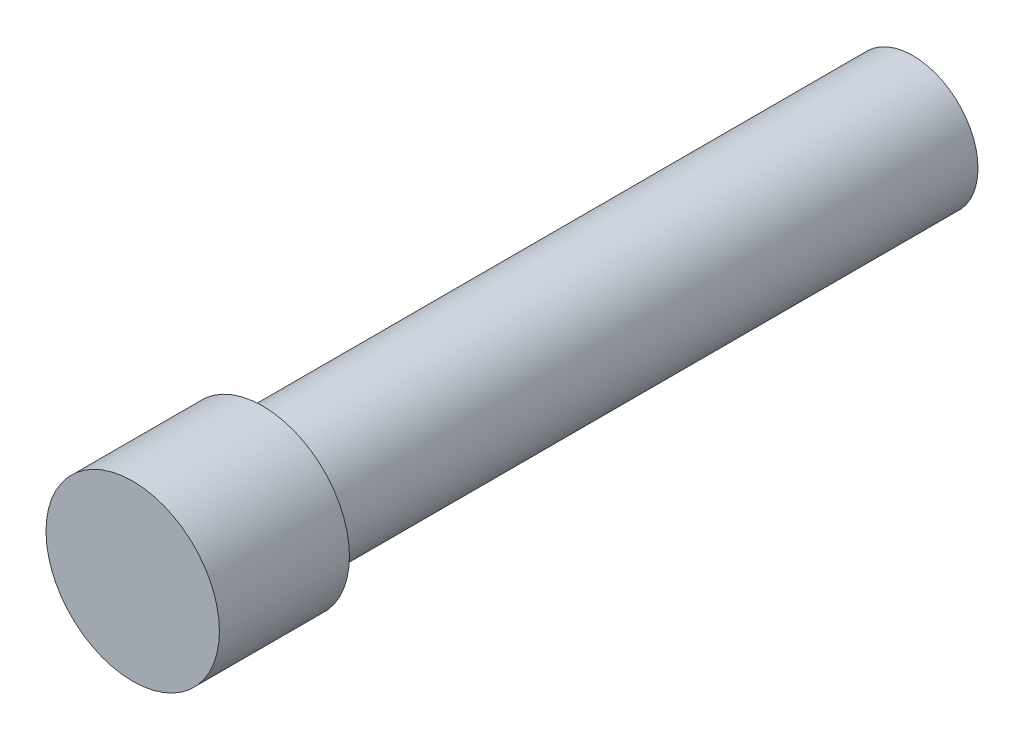
ISO-10303-21;
HEADER;
FILE_DESCRIPTION(('STEP AP214'),'2;1');
FILE_NAME('part.step','',(''),(''),'','','');
FILE_SCHEMA(('AUTOMOTIVE_DESIGN { 1 0 10303 214 1 1 1 1 }'));
ENDSEC;
DATA;
#1=APPLICATION_CONTEXT('core data for automotive mechanical design processes');
#2=APPLICATION_PROTOCOL_DEFINITION('international standard','automotive_design',2000,#1);
#3=PRODUCT_CONTEXT('',#1,'mechanical');
#4=PRODUCT('Part','Part','',(#3));
#5=PRODUCT_RELATED_PRODUCT_CATEGORY('part','',(#4));
#6=PRODUCT_DEFINITION_FORMATION('','',#4);
#7=PRODUCT_DEFINITION_CONTEXT('part definition',#1,'design');
#8=PRODUCT_DEFINITION('design','',#6,#7);
#9=PRODUCT_DEFINITION_SHAPE('','',#8);
#10=(LENGTH_UNIT() NAMED_UNIT(*) SI_UNIT(.MILLI.,.METRE.));
#11=(NAMED_UNIT(*) PLANE_ANGLE_UNIT() SI_UNIT($,.RADIAN.));
#12=(NAMED_UNIT(*) SI_UNIT($,.STERADIAN.) SOLID_ANGLE_UNIT());
#13=UNCERTAINTY_MEASURE_WITH_UNIT(LENGTH_MEASURE(1.E-05),#10,'distance_accuracy_value','');
#14=(GEOMETRIC_REPRESENTATION_CONTEXT(3) GLOBAL_UNCERTAINTY_ASSIGNED_CONTEXT((#13)) GLOBAL_UNIT_ASSIGNED_CONTEXT((#10,
#11,#12)) REPRESENTATION_CONTEXT('',''));
#15=CARTESIAN_POINT('',(0.,0.,0.));
#16=DIRECTION('',(0.,0.,1.));
#17=DIRECTION('',(1.,0.,0.));
#18=AXIS2_PLACEMENT_3D('',#15,#16,#17);
#19=CARTESIAN_POINT('',(0.,0.,15.));
#20=DIRECTION('',(0.,0.,-1.));
#21=DIRECTION('',(-1.,0.,0.));
#22=AXIS2_PLACEMENT_3D('',#19,#20,#21);
#23=CYLINDRICAL_SURFACE('',#22,1.5);
#24=CARTESIAN_POINT('',(0.,0.,15.));
#25=DIRECTION('',(0.,0.,1.));
#26=DIRECTION('',(1.,0.,0.));
#27=AXIS2_PLACEMENT_3D('',#24,#25,#26);
#28=CIRCLE('',#27,1.5);
#29=CARTESIAN_POINT('',(1.5,0.,15.));
#30=VERTEX_POINT('',#29);
#31=EDGE_CURVE('E10',#30,#30,#28,.T.);
#32=ORIENTED_EDGE('',*,*,#31,.F.);
#33=EDGE_LOOP('',(#32));
#34=FACE_BOUND('',#33,.T.);
#35=CARTESIAN_POINT('',(0.,0.,0.));
#36=DIRECTION('',(0.,0.,1.));
#37=DIRECTION('',(1.,0.,0.));
#38=AXIS2_PLACEMENT_3D('',#35,#36,#37);
#39=CIRCLE('',#38,1.5);
#40=CARTESIAN_POINT('',(1.5,0.,0.));
#41=VERTEX_POINT('',#40);
#42=EDGE_CURVE('E34',#41,#41,#39,.T.);
#43=ORIENTED_EDGE('',*,*,#42,.T.);
#44=EDGE_LOOP('',(#43));
#45=FACE_BOUND('',#44,.T.);
#46=ADVANCED_FACE('F31',(#34,#45),#23,.T.);
#47=CARTESIAN_POINT('',(0.,0.,0.));
#48=DIRECTION('',(0.,0.,1.));
#49=DIRECTION('',(1.,0.,0.));
#50=AXIS2_PLACEMENT_3D('',#47,#48,#49);
#51=PLANE('',#50);
#52=ORIENTED_EDGE('',*,*,#42,.F.);
#53=EDGE_LOOP('',(#52));
#54=FACE_BOUND('',#53,.T.);
#55=ADVANCED_FACE('F54',(#54),#51,.F.);
#56=CARTESIAN_POINT('',(0.,0.,18.));
#57=DIRECTION('',(0.,0.,-1.));
#58=DIRECTION('',(-1.,0.,0.));
#59=AXIS2_PLACEMENT_3D('',#56,#57,#58);
#60=CYLINDRICAL_SURFACE('',#59,2.);
#61=CARTESIAN_POINT('',(0.,0.,18.));
#62=DIRECTION('',(0.,0.,1.));
#63=DIRECTION('',(1.,0.,0.));
#64=AXIS2_PLACEMENT_3D('',#61,#62,#63);
#65=CIRCLE('',#64,2.);
#66=CARTESIAN_POINT('',(2.,0.,18.));
#67=VERTEX_POINT('',#66);
#68=EDGE_CURVE('E41',#67,#67,#65,.T.);
#69=ORIENTED_EDGE('',*,*,#68,.F.);
#70=EDGE_LOOP('',(#69));
#71=FACE_BOUND('',#70,.T.);
#72=CARTESIAN_POINT('',(0.,0.,15.));
#73=DIRECTION('',(0.,0.,1.));
#74=DIRECTION('',(1.,0.,0.));
#75=AXIS2_PLACEMENT_3D('',#72,#73,#74);
#76=CIRCLE('',#75,2.);
#77=CARTESIAN_POINT('',(2.,0.,15.));
#78=VERTEX_POINT('',#77);
#79=EDGE_CURVE('E43',#78,#78,#76,.T.);
#80=ORIENTED_EDGE('',*,*,#79,.T.);
#81=EDGE_LOOP('',(#80));
#82=FACE_BOUND('',#81,.T.);
#83=ADVANCED_FACE('F51',(#71,#82),#60,.T.);
#84=CARTESIAN_POINT('',(0.,0.,18.));
#85=DIRECTION('',(0.,0.,1.));
#86=DIRECTION('',(1.,0.,0.));
#87=AXIS2_PLACEMENT_3D('',#84,#85,#86);
#88=PLANE('',#87);
#89=ORIENTED_EDGE('',*,*,#68,.T.);
#90=EDGE_LOOP('',(#89));
#91=FACE_BOUND('',#90,.T.);
#92=ADVANCED_FACE('F49',(#91),#88,.T.);
#93=CARTESIAN_POINT('',(0.,0.,15.));
#94=DIRECTION('',(0.,0.,1.));
#95=DIRECTION('',(1.,0.,0.));
#96=AXIS2_PLACEMENT_3D('',#93,#94,#95);
#97=PLANE('',#96);
#98=ORIENTED_EDGE('',*,*,#31,.T.);
#99=EDGE_LOOP('',(#98));
#100=FACE_BOUND('',#99,.T.);
#101=ORIENTED_EDGE('',*,*,#79,.F.);
#102=EDGE_LOOP('',(#101));
#103=FACE_BOUND('',#102,.T.);
#104=ADVANCED_FACE('F58',(#100,#103),#97,.F.);
#105=CLOSED_SHELL('',(#46,#55,#83,#92,#104));
#106=MANIFOLD_SOLID_BREP('B2',#105);
#107=ADVANCED_BREP_SHAPE_REPRESENTATION('',(#18,#106),#14);
#108=SHAPE_DEFINITION_REPRESENTATION(#9,#107);
ENDSEC;
END-ISO-10303-21;
